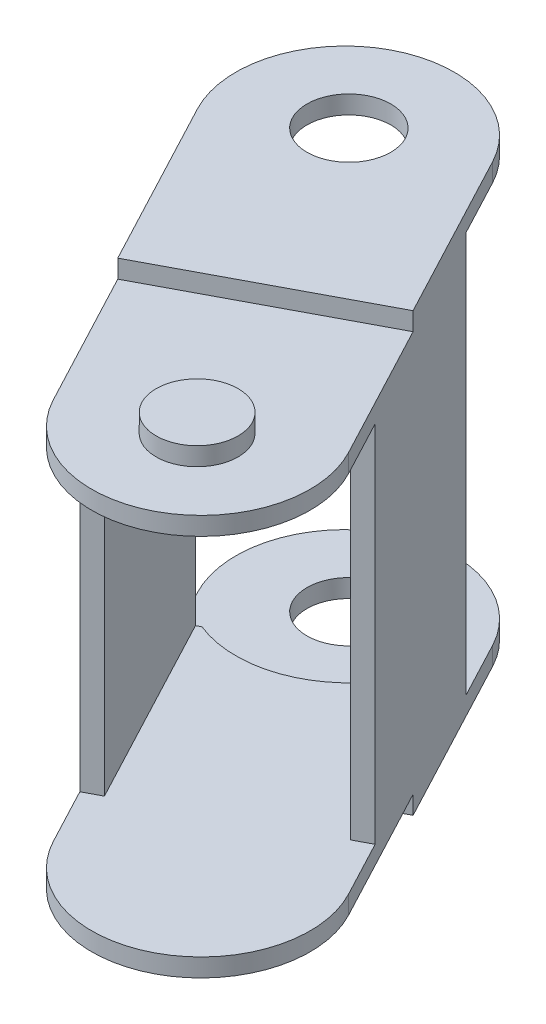
ISO-10303-21;
HEADER;
FILE_DESCRIPTION(('STEP AP214'),'2;1');
FILE_NAME('part.step','',(''),(''),'','','');
FILE_SCHEMA(('AUTOMOTIVE_DESIGN { 1 0 10303 214 1 1 1 1 }'));
ENDSEC;
DATA;
#1=APPLICATION_CONTEXT('core data for automotive mechanical design processes');
#2=APPLICATION_PROTOCOL_DEFINITION('international standard','automotive_design',2000,#1);
#3=PRODUCT_CONTEXT('',#1,'mechanical');
#4=PRODUCT('Part','Part','',(#3));
#5=PRODUCT_RELATED_PRODUCT_CATEGORY('part','',(#4));
#6=PRODUCT_DEFINITION_FORMATION('','',#4);
#7=PRODUCT_DEFINITION_CONTEXT('part definition',#1,'design');
#8=PRODUCT_DEFINITION('design','',#6,#7);
#9=PRODUCT_DEFINITION_SHAPE('','',#8);
#10=(LENGTH_UNIT() NAMED_UNIT(*) SI_UNIT(.MILLI.,.METRE.));
#11=(NAMED_UNIT(*) PLANE_ANGLE_UNIT() SI_UNIT($,.RADIAN.));
#12=(NAMED_UNIT(*) SI_UNIT($,.STERADIAN.) SOLID_ANGLE_UNIT());
#13=UNCERTAINTY_MEASURE_WITH_UNIT(LENGTH_MEASURE(1.E-05),#10,'distance_accuracy_value','');
#14=(GEOMETRIC_REPRESENTATION_CONTEXT(3) GLOBAL_UNCERTAINTY_ASSIGNED_CONTEXT((#13)) GLOBAL_UNIT_ASSIGNED_CONTEXT((#10,
#11,#12)) REPRESENTATION_CONTEXT('',''));
#15=CARTESIAN_POINT('',(0.,0.,0.));
#16=DIRECTION('',(0.,0.,1.));
#17=DIRECTION('',(1.,0.,0.));
#18=AXIS2_PLACEMENT_3D('',#15,#16,#17);
#19=CARTESIAN_POINT('',(-559.9840228653,21.5,64.14330006));
#20=DIRECTION('',(0.,1.,0.));
#21=DIRECTION('',(0.467407290881258,0.,0.884042094264206));
#22=AXIS2_PLACEMENT_3D('',#19,#20,#21);
#23=CYLINDRICAL_SURFACE('',#22,2.25);
#24=CARTESIAN_POINT('',(-559.9840228653,21.,64.14330006));
#25=DIRECTION('',(0.,1.,0.));
#26=DIRECTION('',(0.467407290881257,0.,0.884042094264207));
#27=AXIS2_PLACEMENT_3D('',#24,#25,#26);
#28=CIRCLE('',#27,2.25);
#29=CARTESIAN_POINT('',(-558.932356460817,21.,66.1323947720945));
#30=VERTEX_POINT('',#29);
#31=EDGE_CURVE('E205',#30,#30,#28,.F.);
#32=ORIENTED_EDGE('',*,*,#31,.F.);
#33=EDGE_LOOP('',(#32));
#34=FACE_BOUND('',#33,.T.);
#35=CARTESIAN_POINT('',(-559.9840228653,22.,64.14330006));
#36=DIRECTION('',(0.,-1.,0.));
#37=DIRECTION('',(-0.467407290881309,0.,-0.884042094264179));
#38=AXIS2_PLACEMENT_3D('',#35,#36,#37);
#39=CIRCLE('',#38,2.25);
#40=CARTESIAN_POINT('',(-561.035689269783,22.,62.1542053479056));
#41=VERTEX_POINT('',#40);
#42=EDGE_CURVE('E202',#41,#41,#39,.F.);
#43=ORIENTED_EDGE('',*,*,#42,.F.);
#44=EDGE_LOOP('',(#43));
#45=FACE_BOUND('',#44,.T.);
#46=ADVANCED_FACE('F17',(#34,#45),#23,.T.);
#47=CARTESIAN_POINT('',(-558.886435917672,21.,53.382477466249));
#48=DIRECTION('',(0.,1.,0.));
#49=DIRECTION('',(-0.884042094264264,0.,0.467407290881148));
#50=AXIS2_PLACEMENT_3D('',#47,#48,#49);
#51=PLANE('',#50);
#52=CARTESIAN_POINT('',(-560.217726510876,21.,63.701279012826));
#53=DIRECTION('',(0.,1.,0.));
#54=DIRECTION('',(0.467407290895964,0.,0.884042094256431));
#55=AXIS2_PLACEMENT_3D('',#52,#53,#54);
#56=CIRCLE('',#55,6.);
#57=CARTESIAN_POINT('',(-554.913473945278,21.,60.896835267562));
#58=VERTEX_POINT('',#57);
#59=CARTESIAN_POINT('',(-565.521979076352,21.,66.50572275806));
#60=VERTEX_POINT('',#59);
#61=EDGE_CURVE('E189',#58,#60,#56,.F.);
#62=ORIENTED_EDGE('',*,*,#61,.F.);
#63=DIRECTION('',(-0.467407290870953,0.,-0.884042094269654));
#64=VECTOR('',#63,1.);
#65=CARTESIAN_POINT('',(-554.913473945262,21.,60.896835267553));
#66=LINE('',#65,#64);
#67=CARTESIAN_POINT('',(-558.886435917672,21.,53.382477466249));
#68=VERTEX_POINT('',#67);
#69=EDGE_CURVE('E177',#68,#58,#66,.F.);
#70=ORIENTED_EDGE('',*,*,#69,.F.);
#71=DIRECTION('',(-0.884042094264259,0.,0.467407290881157));
#72=VECTOR('',#71,1.);
#73=CARTESIAN_POINT('',(-558.886435917672,21.,53.382477466249));
#74=LINE('',#73,#72);
#75=CARTESIAN_POINT('',(-569.4949410488,21.,58.9913649568));
#76=VERTEX_POINT('',#75);
#77=EDGE_CURVE('E188',#76,#68,#74,.F.);
#78=ORIENTED_EDGE('',*,*,#77,.F.);
#79=DIRECTION('',(0.467407290876608,0.,0.884042094266664));
#80=VECTOR('',#79,1.);
#81=CARTESIAN_POINT('',(-569.4949410488,21.,58.9913649568));
#82=LINE('',#81,#80);
#83=EDGE_CURVE('E201',#60,#76,#82,.F.);
#84=ORIENTED_EDGE('',*,*,#83,.F.);
#85=EDGE_LOOP('',(#62,#70,#78,#84));
#86=FACE_BOUND('',#85,.T.);
#87=ORIENTED_EDGE('',*,*,#31,.T.);
#88=EDGE_LOOP('',(#87));
#89=FACE_BOUND('',#88,.T.);
#90=ADVANCED_FACE('F199',(#86,#89),#51,.T.);
#91=CARTESIAN_POINT('',(-563.078003699836,22.,63.234009874265));
#92=DIRECTION('',(0.,1.,0.));
#93=DIRECTION('',(0.467407290881148,0.,0.884042094264264));
#94=AXIS2_PLACEMENT_3D('',#91,#92,#93);
#95=PLANE('',#94);
#96=ORIENTED_EDGE('',*,*,#42,.T.);
#97=EDGE_LOOP('',(#96));
#98=FACE_BOUND('',#97,.T.);
#99=ADVANCED_FACE('F629',(#98),#95,.T.);
#100=CARTESIAN_POINT('',(-560.217726510699,-2.,63.701279012733));
#101=DIRECTION('',(0.,1.,0.));
#102=DIRECTION('',(-0.884042094263944,0.,0.467407290881753));
#103=AXIS2_PLACEMENT_3D('',#100,#101,#102);
#104=CYLINDRICAL_SURFACE('',#103,6.);
#105=DIRECTION('',(9.891E-12,-1.,1.8645E-11));
#106=VECTOR('',#105,1.);
#107=CARTESIAN_POINT('',(-565.521979076283,21.,66.505722758023));
#108=LINE('',#107,#106);
#109=CARTESIAN_POINT('',(-565.521979076273,20.,66.505722758042));
#110=VERTEX_POINT('',#109);
#111=EDGE_CURVE('E217',#110,#60,#108,.F.);
#112=ORIENTED_EDGE('',*,*,#111,.F.);
#113=CARTESIAN_POINT('',(-560.217726510699,20.,63.701279012733));
#114=DIRECTION('',(0.,1.,0.));
#115=DIRECTION('',(-0.884042094262301,0.,0.467407290884861));
#116=AXIS2_PLACEMENT_3D('',#113,#114,#115);
#117=CIRCLE('',#116,6.);
#118=CARTESIAN_POINT('',(-554.913473945286,20.,60.896835267548));
#119=VERTEX_POINT('',#118);
#120=EDGE_CURVE('E196',#110,#119,#117,.T.);
#121=ORIENTED_EDGE('',*,*,#120,.T.);
#122=DIRECTION('',(7.503E-12,1.,1.4083E-11));
#123=VECTOR('',#122,1.);
#124=CARTESIAN_POINT('',(-554.913473945286,20.,60.896835267548));
#125=LINE('',#124,#123);
#126=EDGE_CURVE('E181',#119,#58,#125,.T.);
#127=ORIENTED_EDGE('',*,*,#126,.T.);
#128=ORIENTED_EDGE('',*,*,#61,.T.);
#129=EDGE_LOOP('',(#112,#121,#127,#128));
#130=FACE_BOUND('',#129,.T.);
#131=ADVANCED_FACE('F195',(#130),#104,.T.);
#132=CARTESIAN_POINT('',(-554.913473945188,-2.,60.896835267519));
#133=DIRECTION('',(0.884042094264264,0.,-0.467407290881148));
#134=DIRECTION('',(-0.467407290881148,0.,-0.884042094264264));
#135=AXIS2_PLACEMENT_3D('',#132,#133,#134);
#136=PLANE('',#135);
#137=DIRECTION('',(0.,-1.,0.));
#138=VECTOR('',#137,1.);
#139=CARTESIAN_POINT('',(-558.886435917686,22.,53.382477466257));
#140=LINE('',#139,#138);
#141=CARTESIAN_POINT('',(-558.886435917686,22.,53.382477466257));
#142=VERTEX_POINT('',#141);
#143=EDGE_CURVE('E184',#142,#68,#140,.T.);
#144=ORIENTED_EDGE('',*,*,#143,.T.);
#145=ORIENTED_EDGE('',*,*,#69,.T.);
#146=ORIENTED_EDGE('',*,*,#126,.F.);
#147=DIRECTION('',(-0.46740729088115,0.,-0.884042094264263));
#148=VECTOR('',#147,1.);
#149=CARTESIAN_POINT('',(-554.913473945198,20.,60.896835267501));
#150=LINE('',#149,#148);
#151=CARTESIAN_POINT('',(-556.549399463291,20.,57.802687937559));
#152=VERTEX_POINT('',#151);
#153=EDGE_CURVE('E229',#119,#152,#150,.T.);
#154=ORIENTED_EDGE('',*,*,#153,.T.);
#155=DIRECTION('',(0.,-1.,0.));
#156=VECTOR('',#155,1.);
#157=CARTESIAN_POINT('',(-556.549399463291,20.,57.802687937559));
#158=LINE('',#157,#156);
#159=CARTESIAN_POINT('',(-556.549399463291,0.,57.802687937559));
#160=VERTEX_POINT('',#159);
#161=EDGE_CURVE('E233',#152,#160,#158,.T.);
#162=ORIENTED_EDGE('',*,*,#161,.T.);
#163=DIRECTION('',(0.467407290881148,0.,0.884042094264264));
#164=VECTOR('',#163,1.);
#165=CARTESIAN_POINT('',(-556.549399463291,0.,57.802687937559));
#166=LINE('',#165,#164);
#167=CARTESIAN_POINT('',(-554.91347394519,0.,60.896835267515));
#168=VERTEX_POINT('',#167);
#169=EDGE_CURVE('E238',#160,#168,#166,.T.);
#170=ORIENTED_EDGE('',*,*,#169,.T.);
#171=DIRECTION('',(2.046E-12,-1.,3.894E-12));
#172=VECTOR('',#171,1.);
#173=CARTESIAN_POINT('',(-554.91347394519,0.,60.896835267515));
#174=LINE('',#173,#172);
#175=CARTESIAN_POINT('',(-554.913473945188,-1.,60.896835267519));
#176=VERTEX_POINT('',#175);
#177=EDGE_CURVE('E243',#176,#168,#174,.F.);
#178=ORIENTED_EDGE('',*,*,#177,.F.);
#179=DIRECTION('',(-0.467407290881144,0.,-0.884042094264266));
#180=VECTOR('',#179,1.);
#181=CARTESIAN_POINT('',(-554.913473945188,-1.,60.896835267519));
#182=LINE('',#181,#180);
#183=CARTESIAN_POINT('',(-558.886435917686,-1.,53.382477466257));
#184=VERTEX_POINT('',#183);
#185=EDGE_CURVE('E247',#176,#184,#182,.T.);
#186=ORIENTED_EDGE('',*,*,#185,.T.);
#187=DIRECTION('',(-1.14E-13,-1.,-1.49E-13));
#188=VECTOR('',#187,1.);
#189=CARTESIAN_POINT('',(-558.886435917686,-1.,53.382477466257));
#190=LINE('',#189,#188);
#191=CARTESIAN_POINT('',(-558.886435917686,-2.,53.382477466256));
#192=VERTEX_POINT('',#191);
#193=EDGE_CURVE('E252',#184,#192,#190,.T.);
#194=ORIENTED_EDGE('',*,*,#193,.T.);
#195=DIRECTION('',(-0.467407290881152,0.,-0.884042094264262));
#196=VECTOR('',#195,1.);
#197=CARTESIAN_POINT('',(-558.886435917686,-2.,53.382477466256));
#198=LINE('',#197,#196);
#199=CARTESIAN_POINT('',(-563.794212471897,-2.,44.10003547656));
#200=VERTEX_POINT('',#199);
#201=EDGE_CURVE('E257',#192,#200,#198,.T.);
#202=ORIENTED_EDGE('',*,*,#201,.T.);
#203=DIRECTION('',(1.14E-13,1.,0.));
#204=VECTOR('',#203,1.);
#205=CARTESIAN_POINT('',(-563.794212471897,-2.,44.10003547656));
#206=LINE('',#205,#204);
#207=CARTESIAN_POINT('',(-563.794212471897,-1.,44.10003547656));
#208=VERTEX_POINT('',#207);
#209=EDGE_CURVE('E262',#200,#208,#206,.T.);
#210=ORIENTED_EDGE('',*,*,#209,.T.);
#211=DIRECTION('',(0.467407290881133,0.,0.884042094264272));
#212=VECTOR('',#211,1.);
#213=CARTESIAN_POINT('',(-563.794212471897,-1.,44.10003547656));
#214=LINE('',#213,#212);
#215=CARTESIAN_POINT('',(-562.158286953875,-1.,47.194182806368));
#216=VERTEX_POINT('',#215);
#217=EDGE_CURVE('E267',#208,#216,#214,.T.);
#218=ORIENTED_EDGE('',*,*,#217,.T.);
#219=DIRECTION('',(0.,1.,0.));
#220=VECTOR('',#219,1.);
#221=CARTESIAN_POINT('',(-562.158286953875,-1.,47.194182806368));
#222=LINE('',#221,#220);
#223=CARTESIAN_POINT('',(-562.158286953875,21.,47.194182806368));
#224=VERTEX_POINT('',#223);
#225=EDGE_CURVE('E272',#216,#224,#222,.T.);
#226=ORIENTED_EDGE('',*,*,#225,.T.);
#227=DIRECTION('',(-0.467407290881148,0.,-0.884042094264264));
#228=VECTOR('',#227,1.);
#229=CARTESIAN_POINT('',(-562.158286953875,21.,47.194182806368));
#230=LINE('',#229,#228);
#231=CARTESIAN_POINT('',(-563.794212471897,21.,44.10003547656));
#232=VERTEX_POINT('',#231);
#233=EDGE_CURVE('E277',#224,#232,#230,.T.);
#234=ORIENTED_EDGE('',*,*,#233,.T.);
#235=DIRECTION('',(0.,1.,0.));
#236=VECTOR('',#235,1.);
#237=CARTESIAN_POINT('',(-563.794212471897,21.,44.10003547656));
#238=LINE('',#237,#236);
#239=CARTESIAN_POINT('',(-563.794212471897,22.,44.10003547656));
#240=VERTEX_POINT('',#239);
#241=EDGE_CURVE('E282',#232,#240,#238,.T.);
#242=ORIENTED_EDGE('',*,*,#241,.T.);
#243=DIRECTION('',(0.467407290881148,0.,0.884042094264264));
#244=VECTOR('',#243,1.);
#245=CARTESIAN_POINT('',(-563.794212471897,22.,44.10003547656));
#246=LINE('',#245,#244);
#247=EDGE_CURVE('E287',#240,#142,#246,.T.);
#248=ORIENTED_EDGE('',*,*,#247,.T.);
#249=EDGE_LOOP('',(#144,#145,#146,#154,#162,#170,#178,#186,#194,#202,#210,#218,#226,#234,#242,#248));
#250=FACE_BOUND('',#249,.T.);
#251=ADVANCED_FACE('F179',(#250),#136,.T.);
#252=CARTESIAN_POINT('',(-569.494941048811,21.,58.991364956806));
#253=DIRECTION('',(0.467407290881148,0.,0.884042094264264));
#254=DIRECTION('',(0.884042094264264,0.,-0.467407290881148));
#255=AXIS2_PLACEMENT_3D('',#252,#253,#254);
#256=PLANE('',#255);
#257=DIRECTION('',(-0.884042094264264,0.,0.467407290881148));
#258=VECTOR('',#257,1.);
#259=CARTESIAN_POINT('',(-558.886435917672,22.,53.382477466249));
#260=LINE('',#259,#258);
#261=CARTESIAN_POINT('',(-569.494941048811,22.,58.991364956806));
#262=VERTEX_POINT('',#261);
#263=EDGE_CURVE('E291',#262,#142,#260,.F.);
#264=ORIENTED_EDGE('',*,*,#263,.F.);
#265=DIRECTION('',(1.1141E-11,-1.,-5.883E-12));
#266=VECTOR('',#265,1.);
#267=CARTESIAN_POINT('',(-569.494941048811,22.,58.991364956806));
#268=LINE('',#267,#266);
#269=EDGE_CURVE('E295',#76,#262,#268,.F.);
#270=ORIENTED_EDGE('',*,*,#269,.F.);
#271=ORIENTED_EDGE('',*,*,#77,.T.);
#272=ORIENTED_EDGE('',*,*,#143,.F.);
#273=EDGE_LOOP('',(#264,#270,#271,#272));
#274=FACE_BOUND('',#273,.T.);
#275=ADVANCED_FACE('F613',(#274),#256,.T.);
#276=CARTESIAN_POINT('',(-574.402717603068,-2.,49.708922967134));
#277=DIRECTION('',(-0.884042094264264,0.,0.467407290881148));
#278=DIRECTION('',(0.467407290881148,0.,0.884042094264264));
#279=AXIS2_PLACEMENT_3D('',#276,#277,#278);
#280=PLANE('',#279);
#281=ORIENTED_EDGE('',*,*,#83,.T.);
#282=ORIENTED_EDGE('',*,*,#269,.T.);
#283=DIRECTION('',(-0.467407290881152,0.,-0.884042094264262));
#284=VECTOR('',#283,1.);
#285=CARTESIAN_POINT('',(-569.494941048857,22.,58.99136495683));
#286=LINE('',#285,#284);
#287=CARTESIAN_POINT('',(-574.402717603068,22.,49.708922967134));
#288=VERTEX_POINT('',#287);
#289=EDGE_CURVE('E300',#262,#288,#286,.T.);
#290=ORIENTED_EDGE('',*,*,#289,.T.);
#291=DIRECTION('',(0.,-1.,0.));
#292=VECTOR('',#291,1.);
#293=CARTESIAN_POINT('',(-574.402717603068,22.,49.708922967134));
#294=LINE('',#293,#292);
#295=CARTESIAN_POINT('',(-574.402717603068,21.,49.708922967134));
#296=VERTEX_POINT('',#295);
#297=EDGE_CURVE('E305',#296,#288,#294,.F.);
#298=ORIENTED_EDGE('',*,*,#297,.F.);
#299=DIRECTION('',(0.467407290881155,0.,0.88404209426426));
#300=VECTOR('',#299,1.);
#301=CARTESIAN_POINT('',(-574.402717603068,21.,49.708922967134));
#302=LINE('',#301,#300);
#303=CARTESIAN_POINT('',(-572.766792085046,21.,52.803070296942));
#304=VERTEX_POINT('',#303);
#305=EDGE_CURVE('E310',#296,#304,#302,.T.);
#306=ORIENTED_EDGE('',*,*,#305,.T.);
#307=DIRECTION('',(0.,-1.,0.));
#308=VECTOR('',#307,1.);
#309=CARTESIAN_POINT('',(-572.766792085046,21.,52.803070296942));
#310=LINE('',#309,#308);
#311=CARTESIAN_POINT('',(-572.766792085046,-1.,52.803070296942));
#312=VERTEX_POINT('',#311);
#313=EDGE_CURVE('E315',#304,#312,#310,.T.);
#314=ORIENTED_EDGE('',*,*,#313,.T.);
#315=DIRECTION('',(-0.467407290881164,0.,-0.884042094264256));
#316=VECTOR('',#315,1.);
#317=CARTESIAN_POINT('',(-572.766792085046,-1.,52.803070296942));
#318=LINE('',#317,#316);
#319=CARTESIAN_POINT('',(-574.402717603068,-1.,49.708922967134));
#320=VERTEX_POINT('',#319);
#321=EDGE_CURVE('E320',#312,#320,#318,.T.);
#322=ORIENTED_EDGE('',*,*,#321,.T.);
#323=DIRECTION('',(0.,-1.,0.));
#324=VECTOR('',#323,1.);
#325=CARTESIAN_POINT('',(-574.402717603068,-1.,49.708922967134));
#326=LINE('',#325,#324);
#327=CARTESIAN_POINT('',(-574.402717603068,-2.,49.708922967134));
#328=VERTEX_POINT('',#327);
#329=EDGE_CURVE('E325',#328,#320,#326,.F.);
#330=ORIENTED_EDGE('',*,*,#329,.F.);
#331=DIRECTION('',(0.467407290881145,0.,0.884042094264266));
#332=VECTOR('',#331,1.);
#333=CARTESIAN_POINT('',(-574.402717603068,-2.,49.708922967134));
#334=LINE('',#333,#332);
#335=CARTESIAN_POINT('',(-569.494941048857,-2.,58.99136495683));
#336=VERTEX_POINT('',#335);
#337=EDGE_CURVE('E330',#328,#336,#334,.T.);
#338=ORIENTED_EDGE('',*,*,#337,.T.);
#339=DIRECTION('',(1.14E-13,1.,0.));
#340=VECTOR('',#339,1.);
#341=CARTESIAN_POINT('',(-569.494941048857,-2.,58.99136495683));
#342=LINE('',#341,#340);
#343=CARTESIAN_POINT('',(-569.494941048857,-1.,58.99136495683));
#344=VERTEX_POINT('',#343);
#345=EDGE_CURVE('E335',#336,#344,#342,.T.);
#346=ORIENTED_EDGE('',*,*,#345,.T.);
#347=DIRECTION('',(0.467407290881141,0.,0.884042094264268));
#348=VECTOR('',#347,1.);
#349=CARTESIAN_POINT('',(-569.494941048857,-1.,58.99136495683));
#350=LINE('',#349,#348);
#351=CARTESIAN_POINT('',(-565.521979076371,-1.,66.50572275807));
#352=VERTEX_POINT('',#351);
#353=EDGE_CURVE('E340',#344,#352,#350,.T.);
#354=ORIENTED_EDGE('',*,*,#353,.T.);
#355=DIRECTION('',(2.501E-12,1.,4.69E-12));
#356=VECTOR('',#355,1.);
#357=CARTESIAN_POINT('',(-565.521979076371,-1.,66.50572275807));
#358=LINE('',#357,#356);
#359=CARTESIAN_POINT('',(-565.521979076369,0.,66.505722758075));
#360=VERTEX_POINT('',#359);
#361=EDGE_CURVE('E345',#352,#360,#358,.T.);
#362=ORIENTED_EDGE('',*,*,#361,.T.);
#363=DIRECTION('',(-0.467407290881145,0.,-0.884042094264266));
#364=VECTOR('',#363,1.);
#365=CARTESIAN_POINT('',(-565.521979076369,0.,66.505722758075));
#366=LINE('',#365,#364);
#367=CARTESIAN_POINT('',(-567.157904594462,0.,63.411575428133));
#368=VERTEX_POINT('',#367);
#369=EDGE_CURVE('E350',#360,#368,#366,.T.);
#370=ORIENTED_EDGE('',*,*,#369,.T.);
#371=DIRECTION('',(0.,1.,0.));
#372=VECTOR('',#371,1.);
#373=CARTESIAN_POINT('',(-567.157904594462,0.,63.411575428133));
#374=LINE('',#373,#372);
#375=CARTESIAN_POINT('',(-567.157904594462,20.,63.411575428133));
#376=VERTEX_POINT('',#375);
#377=EDGE_CURVE('E355',#368,#376,#374,.T.);
#378=ORIENTED_EDGE('',*,*,#377,.T.);
#379=DIRECTION('',(0.467407290881164,0.,0.884042094264256));
#380=VECTOR('',#379,1.);
#381=CARTESIAN_POINT('',(-567.157904594462,20.,63.411575428133));
#382=LINE('',#381,#380);
#383=EDGE_CURVE('E360',#376,#110,#382,.T.);
#384=ORIENTED_EDGE('',*,*,#383,.T.);
#385=ORIENTED_EDGE('',*,*,#111,.T.);
#386=EDGE_LOOP('',(#281,#282,#290,#298,#306,#314,#322,#330,#338,#346,#354,#362,#370,#378,#384,#385));
#387=FACE_BOUND('',#386,.T.);
#388=ADVANCED_FACE('F555',(#387),#280,.T.);
#389=CARTESIAN_POINT('',(-572.766792085031,20.,52.803070296933));
#390=DIRECTION('',(0.,-1.,0.));
#391=DIRECTION('',(0.884042094264264,0.,-0.467407290881148));
#392=AXIS2_PLACEMENT_3D('',#389,#390,#391);
#393=PLANE('',#392);
#394=CARTESIAN_POINT('',(-569.332168682923,20.,46.462458174715));
#395=DIRECTION('',(0.,1.,0.));
#396=DIRECTION('',(0.467407290881122,0.,0.884042094264278));
#397=AXIS2_PLACEMENT_3D('',#394,#395,#396);
#398=CIRCLE('',#397,6.2);
#399=CARTESIAN_POINT('',(-571.650324462012,20.,52.212775886274));
#400=VERTEX_POINT('',#399);
#401=CARTESIAN_POINT('',(-563.274754576909,20.,47.784477217036));
#402=VERTEX_POINT('',#401);
#403=EDGE_CURVE('E365',#400,#402,#398,.T.);
#404=ORIENTED_EDGE('',*,*,#403,.T.);
#405=DIRECTION('',(0.884042094264154,0.,-0.467407290881357));
#406=VECTOR('',#405,1.);
#407=CARTESIAN_POINT('',(-563.274754576909,20.,47.784477217036));
#408=LINE('',#407,#406);
#409=CARTESIAN_POINT('',(-563.042329048139,20.,47.661590097249));
#410=VERTEX_POINT('',#409);
#411=EDGE_CURVE('E370',#402,#410,#408,.T.);
#412=ORIENTED_EDGE('',*,*,#411,.T.);
#413=DIRECTION('',(0.467407290881126,0.,0.884042094264276));
#414=VECTOR('',#413,1.);
#415=CARTESIAN_POINT('',(-563.042329048139,20.,47.661590097249));
#416=LINE('',#415,#414);
#417=CARTESIAN_POINT('',(-557.433441557555,20.,58.27009522844));
#418=VERTEX_POINT('',#417);
#419=EDGE_CURVE('E375',#418,#410,#416,.F.);
#420=ORIENTED_EDGE('',*,*,#419,.F.);
#421=DIRECTION('',(0.884042094264369,0.,-0.46740729088095));
#422=VECTOR('',#421,1.);
#423=CARTESIAN_POINT('',(-557.433441557555,20.,58.27009522844));
#424=LINE('',#423,#422);
#425=EDGE_CURVE('E379',#152,#418,#424,.F.);
#426=ORIENTED_EDGE('',*,*,#425,.F.);
#427=ORIENTED_EDGE('',*,*,#153,.F.);
#428=ORIENTED_EDGE('',*,*,#120,.F.);
#429=ORIENTED_EDGE('',*,*,#383,.F.);
#430=DIRECTION('',(0.884042094264311,0.,-0.467407290881059));
#431=VECTOR('',#430,1.);
#432=CARTESIAN_POINT('',(-567.157904594446,20.,63.411575428124));
#433=LINE('',#432,#431);
#434=CARTESIAN_POINT('',(-566.273862500197,20.,62.944168137251));
#435=VERTEX_POINT('',#434);
#436=EDGE_CURVE('E384',#435,#376,#433,.F.);
#437=ORIENTED_EDGE('',*,*,#436,.F.);
#438=DIRECTION('',(-0.467407290881135,0.,-0.884042094264271));
#439=VECTOR('',#438,1.);
#440=CARTESIAN_POINT('',(-566.273862500197,20.,62.944168137251));
#441=LINE('',#440,#439);
#442=CARTESIAN_POINT('',(-571.882749990781,20.,52.335663006061));
#443=VERTEX_POINT('',#442);
#444=EDGE_CURVE('E388',#443,#435,#441,.F.);
#445=ORIENTED_EDGE('',*,*,#444,.F.);
#446=DIRECTION('',(0.884042094263498,0.,-0.467407290882598));
#447=VECTOR('',#446,1.);
#448=CARTESIAN_POINT('',(-571.882749990781,20.,52.335663006061));
#449=LINE('',#448,#447);
#450=EDGE_CURVE('E392',#443,#400,#449,.T.);
#451=ORIENTED_EDGE('',*,*,#450,.T.);
#452=EDGE_LOOP('',(#404,#412,#420,#426,#427,#428,#429,#437,#445,#451));
#453=FACE_BOUND('',#452,.T.);
#454=ADVANCED_FACE('F557',(#453),#393,.T.);
#455=CARTESIAN_POINT('',(-557.433441557555,20.,58.27009522844));
#456=DIRECTION('',(0.467407290881145,0.,0.884042094264266));
#457=DIRECTION('',(0.,-1.,0.));
#458=AXIS2_PLACEMENT_3D('',#455,#456,#457);
#459=PLANE('',#458);
#460=DIRECTION('',(0.,-1.,0.));
#461=VECTOR('',#460,1.);
#462=CARTESIAN_POINT('',(-557.433441557555,20.,58.27009522844));
#463=LINE('',#462,#461);
#464=CARTESIAN_POINT('',(-557.433441557555,0.,58.27009522844));
#465=VERTEX_POINT('',#464);
#466=EDGE_CURVE('E397',#465,#418,#463,.F.);
#467=ORIENTED_EDGE('',*,*,#466,.F.);
#468=DIRECTION('',(0.884042094264279,0.,-0.46740729088112));
#469=VECTOR('',#468,1.);
#470=CARTESIAN_POINT('',(-557.433441557555,0.,58.27009522844));
#471=LINE('',#470,#469);
#472=EDGE_CURVE('E401',#465,#160,#471,.T.);
#473=ORIENTED_EDGE('',*,*,#472,.T.);
#474=ORIENTED_EDGE('',*,*,#161,.F.);
#475=ORIENTED_EDGE('',*,*,#425,.T.);
#476=EDGE_LOOP('',(#467,#473,#474,#475));
#477=FACE_BOUND('',#476,.T.);
#478=ADVANCED_FACE('F563',(#477),#459,.T.);
#479=CARTESIAN_POINT('',(-572.766792085025,0.,52.803070296931));
#480=DIRECTION('',(0.,1.,0.));
#481=DIRECTION('',(0.467407290881148,0.,0.884042094264264));
#482=AXIS2_PLACEMENT_3D('',#479,#480,#481);
#483=PLANE('',#482);
#484=CARTESIAN_POINT('',(-569.332168682923,0.,46.462458174715));
#485=DIRECTION('',(0.,-1.,0.));
#486=DIRECTION('',(0.467407290881137,0.,0.88404209426427));
#487=AXIS2_PLACEMENT_3D('',#484,#485,#486);
#488=CIRCLE('',#487,6.2);
#489=CARTESIAN_POINT('',(-563.274754576909,0.,47.784477217036));
#490=VERTEX_POINT('',#489);
#491=CARTESIAN_POINT('',(-571.650324462012,0.,52.212775886274));
#492=VERTEX_POINT('',#491);
#493=EDGE_CURVE('E406',#490,#492,#488,.T.);
#494=ORIENTED_EDGE('',*,*,#493,.T.);
#495=DIRECTION('',(-0.884042094263938,0.,0.467407290881764));
#496=VECTOR('',#495,1.);
#497=CARTESIAN_POINT('',(-571.650324462012,0.,52.212775886274));
#498=LINE('',#497,#496);
#499=CARTESIAN_POINT('',(-571.882749990781,0.,52.335663006061));
#500=VERTEX_POINT('',#499);
#501=EDGE_CURVE('E411',#492,#500,#498,.T.);
#502=ORIENTED_EDGE('',*,*,#501,.T.);
#503=DIRECTION('',(0.467407290881137,0.,0.88404209426427));
#504=VECTOR('',#503,1.);
#505=CARTESIAN_POINT('',(-571.882749990781,0.,52.335663006061));
#506=LINE('',#505,#504);
#507=CARTESIAN_POINT('',(-566.273862500197,0.,62.944168137251));
#508=VERTEX_POINT('',#507);
#509=EDGE_CURVE('E416',#508,#500,#506,.F.);
#510=ORIENTED_EDGE('',*,*,#509,.F.);
#511=DIRECTION('',(-0.884042094264277,0.,0.467407290881123));
#512=VECTOR('',#511,1.);
#513=CARTESIAN_POINT('',(-566.273862500197,0.,62.944168137251));
#514=LINE('',#513,#512);
#515=EDGE_CURVE('E420',#368,#508,#514,.F.);
#516=ORIENTED_EDGE('',*,*,#515,.F.);
#517=ORIENTED_EDGE('',*,*,#369,.F.);
#518=CARTESIAN_POINT('',(-560.217726510876,0.,63.701279012826));
#519=DIRECTION('',(0.,1.,0.));
#520=DIRECTION('',(0.467407290895982,0.,0.884042094256421));
#521=AXIS2_PLACEMENT_3D('',#518,#519,#520);
#522=CIRCLE('',#521,6.);
#523=EDGE_CURVE('E425',#168,#360,#522,.F.);
#524=ORIENTED_EDGE('',*,*,#523,.F.);
#525=ORIENTED_EDGE('',*,*,#169,.F.);
#526=ORIENTED_EDGE('',*,*,#472,.F.);
#527=DIRECTION('',(-0.467407290881135,0.,-0.884042094264271));
#528=VECTOR('',#527,1.);
#529=CARTESIAN_POINT('',(-557.433441557555,0.,58.27009522844));
#530=LINE('',#529,#528);
#531=CARTESIAN_POINT('',(-563.042329048139,0.,47.661590097249));
#532=VERTEX_POINT('',#531);
#533=EDGE_CURVE('E429',#532,#465,#530,.F.);
#534=ORIENTED_EDGE('',*,*,#533,.F.);
#535=DIRECTION('',(-0.884042094263954,0.,0.467407290881735));
#536=VECTOR('',#535,1.);
#537=CARTESIAN_POINT('',(-563.042329048139,0.,47.661590097249));
#538=LINE('',#537,#536);
#539=EDGE_CURVE('E433',#532,#490,#538,.T.);
#540=ORIENTED_EDGE('',*,*,#539,.T.);
#541=EDGE_LOOP('',(#494,#502,#510,#516,#517,#524,#525,#526,#534,#540));
#542=FACE_BOUND('',#541,.T.);
#543=ADVANCED_FACE('F549',(#542),#483,.T.);
#544=CARTESIAN_POINT('',(-560.217726510876,-2.,63.701279012826));
#545=DIRECTION('',(0.,1.,0.));
#546=DIRECTION('',(0.467407290895968,0.,0.884042094256429));
#547=AXIS2_PLACEMENT_3D('',#544,#545,#546);
#548=CYLINDRICAL_SURFACE('',#547,6.);
#549=ORIENTED_EDGE('',*,*,#177,.T.);
#550=ORIENTED_EDGE('',*,*,#523,.T.);
#551=ORIENTED_EDGE('',*,*,#361,.F.);
#552=CARTESIAN_POINT('',(-560.217726510699,-1.,63.701279012733));
#553=DIRECTION('',(0.,-1.,0.));
#554=DIRECTION('',(0.467407290866486,0.,0.884042094272016));
#555=AXIS2_PLACEMENT_3D('',#552,#553,#554);
#556=CIRCLE('',#555,6.);
#557=EDGE_CURVE('E438',#352,#176,#556,.F.);
#558=ORIENTED_EDGE('',*,*,#557,.T.);
#559=EDGE_LOOP('',(#549,#550,#551,#558));
#560=FACE_BOUND('',#559,.T.);
#561=ADVANCED_FACE('F570',(#560),#548,.T.);
#562=CARTESIAN_POINT('',(-569.494941048843,-1.,58.991364956823));
#563=DIRECTION('',(0.,-1.,0.));
#564=DIRECTION('',(0.884042094264264,0.,-0.467407290881148));
#565=AXIS2_PLACEMENT_3D('',#562,#563,#564);
#566=PLANE('',#565);
#567=ORIENTED_EDGE('',*,*,#557,.F.);
#568=ORIENTED_EDGE('',*,*,#353,.F.);
#569=DIRECTION('',(0.88404209426426,0.,-0.467407290881155));
#570=VECTOR('',#569,1.);
#571=CARTESIAN_POINT('',(-569.494941048843,-1.,58.991364956823));
#572=LINE('',#571,#570);
#573=EDGE_CURVE('E443',#344,#184,#572,.T.);
#574=ORIENTED_EDGE('',*,*,#573,.T.);
#575=ORIENTED_EDGE('',*,*,#185,.F.);
#576=EDGE_LOOP('',(#567,#568,#574,#575));
#577=FACE_BOUND('',#576,.T.);
#578=CARTESIAN_POINT('',(-559.9840228653,-1.,64.14330006));
#579=DIRECTION('',(0.,1.,0.));
#580=DIRECTION('',(0.467407290881296,0.,0.884042094264186));
#581=AXIS2_PLACEMENT_3D('',#578,#579,#580);
#582=CIRCLE('',#581,2.25);
#583=CARTESIAN_POINT('',(-558.932356460817,-1.,66.1323947720944));
#584=VERTEX_POINT('',#583);
#585=EDGE_CURVE('E448',#584,#584,#582,.T.);
#586=ORIENTED_EDGE('',*,*,#585,.T.);
#587=EDGE_LOOP('',(#586));
#588=FACE_BOUND('',#587,.T.);
#589=ADVANCED_FACE('F574',(#577,#588),#566,.T.);
#590=CARTESIAN_POINT('',(-569.494941048843,-2.,58.991364956823));
#591=DIRECTION('',(0.467407290881148,0.,0.884042094264264));
#592=DIRECTION('',(0.884042094264264,0.,-0.467407290881148));
#593=AXIS2_PLACEMENT_3D('',#590,#591,#592);
#594=PLANE('',#593);
#595=ORIENTED_EDGE('',*,*,#573,.F.);
#596=ORIENTED_EDGE('',*,*,#345,.F.);
#597=DIRECTION('',(0.884042094264265,0.,-0.467407290881147));
#598=VECTOR('',#597,1.);
#599=CARTESIAN_POINT('',(-569.494941048834,-2.,58.991364956818));
#600=LINE('',#599,#598);
#601=EDGE_CURVE('E453',#192,#336,#600,.F.);
#602=ORIENTED_EDGE('',*,*,#601,.F.);
#603=ORIENTED_EDGE('',*,*,#193,.F.);
#604=EDGE_LOOP('',(#595,#596,#602,#603));
#605=FACE_BOUND('',#604,.T.);
#606=ADVANCED_FACE('F578',(#605),#594,.T.);
#607=CARTESIAN_POINT('',(-577.207161348285,-2.,44.404670401624));
#608=DIRECTION('',(0.,-1.,0.));
#609=DIRECTION('',(0.884042094264264,0.,-0.467407290881148));
#610=AXIS2_PLACEMENT_3D('',#607,#608,#609);
#611=PLANE('',#610);
#612=ORIENTED_EDGE('',*,*,#601,.T.);
#613=ORIENTED_EDGE('',*,*,#337,.F.);
#614=CARTESIAN_POINT('',(-569.098465037524,-2.,46.904479221982));
#615=DIRECTION('',(0.,-1.,0.));
#616=DIRECTION('',(-0.467407290866339,0.,-0.884042094272094));
#617=AXIS2_PLACEMENT_3D('',#614,#615,#616);
#618=CIRCLE('',#617,6.);
#619=EDGE_CURVE('E455',#200,#328,#618,.F.);
#620=ORIENTED_EDGE('',*,*,#619,.F.);
#621=ORIENTED_EDGE('',*,*,#201,.F.);
#622=EDGE_LOOP('',(#612,#613,#620,#621));
#623=FACE_BOUND('',#622,.T.);
#624=CARTESIAN_POINT('',(-569.3321686827,-2.,46.4624581746));
#625=DIRECTION('',(0.,1.,0.));
#626=DIRECTION('',(0.467407290881318,0.,0.884042094264174));
#627=AXIS2_PLACEMENT_3D('',#624,#625,#626);
#628=CIRCLE('',#627,2.3);
#629=CARTESIAN_POINT('',(-568.257131913673,-2.,48.4957549914076));
#630=VERTEX_POINT('',#629);
#631=EDGE_CURVE('E459',#630,#630,#628,.T.);
#632=ORIENTED_EDGE('',*,*,#631,.T.);
#633=EDGE_LOOP('',(#632));
#634=FACE_BOUND('',#633,.T.);
#635=ADVANCED_FACE('F581',(#623,#634),#611,.T.);
#636=CARTESIAN_POINT('',(-569.098465037524,-2.,46.904479221982));
#637=DIRECTION('',(0.,1.,0.));
#638=DIRECTION('',(0.884042094256467,0.,-0.467407290895896));
#639=AXIS2_PLACEMENT_3D('',#636,#637,#638);
#640=CYLINDRICAL_SURFACE('',#639,6.);
#641=ORIENTED_EDGE('',*,*,#209,.F.);
#642=ORIENTED_EDGE('',*,*,#619,.T.);
#643=ORIENTED_EDGE('',*,*,#329,.T.);
#644=CARTESIAN_POINT('',(-569.098465037347,-1.,46.904479221889));
#645=DIRECTION('',(0.,1.,0.));
#646=DIRECTION('',(-0.467407290895849,0.,-0.884042094256491));
#647=AXIS2_PLACEMENT_3D('',#644,#645,#646);
#648=CIRCLE('',#647,6.);
#649=EDGE_CURVE('E464',#320,#208,#648,.F.);
#650=ORIENTED_EDGE('',*,*,#649,.T.);
#651=EDGE_LOOP('',(#641,#642,#643,#650));
#652=FACE_BOUND('',#651,.T.);
#653=ADVANCED_FACE('F587',(#652),#640,.T.);
#654=CARTESIAN_POINT('',(-577.20716134822,-1.,44.40467040159));
#655=DIRECTION('',(0.,1.,0.));
#656=DIRECTION('',(0.467407290881148,0.,0.884042094264264));
#657=AXIS2_PLACEMENT_3D('',#654,#655,#656);
#658=PLANE('',#657);
#659=ORIENTED_EDGE('',*,*,#217,.F.);
#660=ORIENTED_EDGE('',*,*,#649,.F.);
#661=ORIENTED_EDGE('',*,*,#321,.F.);
#662=DIRECTION('',(0.884042094264084,0.,-0.467407290881489));
#663=VECTOR('',#662,1.);
#664=CARTESIAN_POINT('',(-572.76679208488,-1.,52.803070296855));
#665=LINE('',#664,#663);
#666=CARTESIAN_POINT('',(-571.650324462012,-1.,52.212775886274));
#667=VERTEX_POINT('',#666);
#668=EDGE_CURVE('E467',#667,#312,#665,.F.);
#669=ORIENTED_EDGE('',*,*,#668,.F.);
#670=CARTESIAN_POINT('',(-569.332168682923,-1.,46.462458174715));
#671=DIRECTION('',(0.,1.,0.));
#672=DIRECTION('',(0.467407290881107,0.,0.884042094264286));
#673=AXIS2_PLACEMENT_3D('',#670,#671,#672);
#674=CIRCLE('',#673,6.2);
#675=CARTESIAN_POINT('',(-563.274754576909,-1.,47.784477217036));
#676=VERTEX_POINT('',#675);
#677=EDGE_CURVE('E471',#676,#667,#674,.F.);
#678=ORIENTED_EDGE('',*,*,#677,.F.);
#679=DIRECTION('',(0.884042094264222,0.,-0.467407290881228));
#680=VECTOR('',#679,1.);
#681=CARTESIAN_POINT('',(-563.274754576909,-1.,47.784477217036));
#682=LINE('',#681,#680);
#683=EDGE_CURVE('E475',#216,#676,#682,.F.);
#684=ORIENTED_EDGE('',*,*,#683,.F.);
#685=EDGE_LOOP('',(#659,#660,#661,#669,#678,#684));
#686=FACE_BOUND('',#685,.T.);
#687=CARTESIAN_POINT('',(-569.3321686827,-1.,46.4624581746));
#688=DIRECTION('',(0.,-1.,0.));
#689=DIRECTION('',(-0.467407290881286,0.,-0.884042094264191));
#690=AXIS2_PLACEMENT_3D('',#687,#688,#689);
#691=CIRCLE('',#690,2.3);
#692=CARTESIAN_POINT('',(-570.407205451727,-1.,44.4291613577924));
#693=VERTEX_POINT('',#692);
#694=EDGE_CURVE('E480',#693,#693,#691,.T.);
#695=ORIENTED_EDGE('',*,*,#694,.T.);
#696=EDGE_LOOP('',(#695));
#697=FACE_BOUND('',#696,.T.);
#698=ADVANCED_FACE('F590',(#686,#697),#658,.T.);
#699=CARTESIAN_POINT('',(-563.274754576909,-1.,47.784477217036));
#700=DIRECTION('',(-0.467407290881148,0.,-0.884042094264264));
#701=DIRECTION('',(0.,1.,0.));
#702=AXIS2_PLACEMENT_3D('',#699,#700,#701);
#703=PLANE('',#702);
#704=DIRECTION('',(-1.14E-13,1.,0.));
#705=VECTOR('',#704,1.);
#706=CARTESIAN_POINT('',(-563.274754576909,20.,47.784477217035));
#707=LINE('',#706,#705);
#708=CARTESIAN_POINT('',(-563.274754576909,21.,47.784477217036));
#709=VERTEX_POINT('',#708);
#710=EDGE_CURVE('E485',#402,#709,#707,.T.);
#711=ORIENTED_EDGE('',*,*,#710,.T.);
#712=DIRECTION('',(0.884042094264262,0.,-0.467407290881151));
#713=VECTOR('',#712,1.);
#714=CARTESIAN_POINT('',(-563.274754576909,21.,47.784477217036));
#715=LINE('',#714,#713);
#716=EDGE_CURVE('E487',#709,#224,#715,.T.);
#717=ORIENTED_EDGE('',*,*,#716,.T.);
#718=ORIENTED_EDGE('',*,*,#225,.F.);
#719=ORIENTED_EDGE('',*,*,#683,.T.);
#720=DIRECTION('',(-1.14E-13,1.,0.));
#721=VECTOR('',#720,1.);
#722=CARTESIAN_POINT('',(-563.274754576909,-1.,47.784477217035));
#723=LINE('',#722,#721);
#724=EDGE_CURVE('E492',#676,#490,#723,.T.);
#725=ORIENTED_EDGE('',*,*,#724,.T.);
#726=ORIENTED_EDGE('',*,*,#539,.F.);
#727=DIRECTION('',(0.,1.,0.));
#728=VECTOR('',#727,1.);
#729=CARTESIAN_POINT('',(-563.042329048139,0.,47.661590097249));
#730=LINE('',#729,#728);
#731=EDGE_CURVE('E497',#410,#532,#730,.F.);
#732=ORIENTED_EDGE('',*,*,#731,.F.);
#733=ORIENTED_EDGE('',*,*,#411,.F.);
#734=EDGE_LOOP('',(#711,#717,#718,#719,#725,#726,#732,#733));
#735=FACE_BOUND('',#734,.T.);
#736=ADVANCED_FACE('F595',(#735),#703,.T.);
#737=CARTESIAN_POINT('',(-577.207161348247,21.,44.404670401604));
#738=DIRECTION('',(0.,-1.,0.));
#739=DIRECTION('',(0.884042094264264,0.,-0.467407290881148));
#740=AXIS2_PLACEMENT_3D('',#737,#738,#739);
#741=PLANE('',#740);
#742=ORIENTED_EDGE('',*,*,#305,.F.);
#743=CARTESIAN_POINT('',(-569.098465037524,21.,46.904479221982));
#744=DIRECTION('',(0.,-1.,0.));
#745=DIRECTION('',(-0.467407290866358,0.,-0.884042094272084));
#746=AXIS2_PLACEMENT_3D('',#743,#744,#745);
#747=CIRCLE('',#746,6.);
#748=EDGE_CURVE('E501',#232,#296,#747,.F.);
#749=ORIENTED_EDGE('',*,*,#748,.F.);
#750=ORIENTED_EDGE('',*,*,#233,.F.);
#751=ORIENTED_EDGE('',*,*,#716,.F.);
#752=CARTESIAN_POINT('',(-569.332168682923,21.,46.462458174715));
#753=DIRECTION('',(0.,-1.,0.));
#754=DIRECTION('',(0.467407290881137,0.,0.88404209426427));
#755=AXIS2_PLACEMENT_3D('',#752,#753,#754);
#756=CIRCLE('',#755,6.2);
#757=CARTESIAN_POINT('',(-571.650324462012,21.,52.212775886274));
#758=VERTEX_POINT('',#757);
#759=EDGE_CURVE('E36',#758,#709,#756,.F.);
#760=ORIENTED_EDGE('',*,*,#759,.F.);
#761=DIRECTION('',(-0.884042094264216,0.,0.467407290881239));
#762=VECTOR('',#761,1.);
#763=CARTESIAN_POINT('',(-571.650324462012,21.,52.212775886274));
#764=LINE('',#763,#762);
#765=EDGE_CURVE('E508',#304,#758,#764,.F.);
#766=ORIENTED_EDGE('',*,*,#765,.F.);
#767=EDGE_LOOP('',(#742,#749,#750,#751,#760,#766));
#768=FACE_BOUND('',#767,.T.);
#769=CARTESIAN_POINT('',(-569.3321686827,21.,46.4624581746));
#770=DIRECTION('',(0.,1.,0.));
#771=DIRECTION('',(-0.467407290881282,0.,-0.884042094264193));
#772=AXIS2_PLACEMENT_3D('',#769,#770,#771);
#773=CIRCLE('',#772,2.3);
#774=CARTESIAN_POINT('',(-570.407205451727,21.,44.4291613577924));
#775=VERTEX_POINT('',#774);
#776=EDGE_CURVE('E513',#775,#775,#773,.T.);
#777=ORIENTED_EDGE('',*,*,#776,.T.);
#778=EDGE_LOOP('',(#777));
#779=FACE_BOUND('',#778,.T.);
#780=ADVANCED_FACE('F600',(#768,#779),#741,.T.);
#781=CARTESIAN_POINT('',(-569.098465037524,-2.,46.904479221982));
#782=DIRECTION('',(0.,1.,0.));
#783=DIRECTION('',(0.884042094256465,0.,-0.467407290895898));
#784=AXIS2_PLACEMENT_3D('',#781,#782,#783);
#785=CYLINDRICAL_SURFACE('',#784,6.);
#786=ORIENTED_EDGE('',*,*,#748,.T.);
#787=ORIENTED_EDGE('',*,*,#297,.T.);
#788=CARTESIAN_POINT('',(-569.098465037347,22.,46.904479221889));
#789=DIRECTION('',(0.,1.,0.));
#790=DIRECTION('',(-0.467407290895849,0.,-0.884042094256491));
#791=AXIS2_PLACEMENT_3D('',#788,#789,#790);
#792=CIRCLE('',#791,6.);
#793=EDGE_CURVE('E518',#288,#240,#792,.F.);
#794=ORIENTED_EDGE('',*,*,#793,.T.);
#795=ORIENTED_EDGE('',*,*,#241,.F.);
#796=EDGE_LOOP('',(#786,#787,#794,#795));
#797=FACE_BOUND('',#796,.T.);
#798=ADVANCED_FACE('F605',(#797),#785,.T.);
#799=CARTESIAN_POINT('',(-577.207161348297,22.,44.40467040163));
#800=DIRECTION('',(0.,1.,0.));
#801=DIRECTION('',(0.467407290881148,0.,0.884042094264264));
#802=AXIS2_PLACEMENT_3D('',#799,#800,#801);
#803=PLANE('',#802);
#804=ORIENTED_EDGE('',*,*,#263,.T.);
#805=ORIENTED_EDGE('',*,*,#247,.F.);
#806=ORIENTED_EDGE('',*,*,#793,.F.);
#807=ORIENTED_EDGE('',*,*,#289,.F.);
#808=EDGE_LOOP('',(#804,#805,#806,#807));
#809=FACE_BOUND('',#808,.T.);
#810=CARTESIAN_POINT('',(-569.3321686827,22.,46.4624581746));
#811=DIRECTION('',(0.,-1.,0.));
#812=DIRECTION('',(0.467407290881233,0.,0.884042094264219));
#813=AXIS2_PLACEMENT_3D('',#810,#811,#812);
#814=CIRCLE('',#813,2.3);
#815=CARTESIAN_POINT('',(-568.257131913673,22.,48.4957549914077));
#816=VERTEX_POINT('',#815);
#817=EDGE_CURVE('E521',#816,#816,#814,.T.);
#818=ORIENTED_EDGE('',*,*,#817,.T.);
#819=EDGE_LOOP('',(#818));
#820=FACE_BOUND('',#819,.T.);
#821=ADVANCED_FACE('F608',(#809,#820),#803,.T.);
#822=CARTESIAN_POINT('',(-572.76679208488,-1.,52.803070296854));
#823=DIRECTION('',(-0.467407290881148,0.,-0.884042094264264));
#824=DIRECTION('',(0.,1.,0.));
#825=AXIS2_PLACEMENT_3D('',#822,#823,#824);
#826=PLANE('',#825);
#827=DIRECTION('',(0.,-1.,0.));
#828=VECTOR('',#827,1.);
#829=CARTESIAN_POINT('',(-571.650324462012,21.,52.212775886275));
#830=LINE('',#829,#828);
#831=EDGE_CURVE('E32',#758,#400,#830,.T.);
#832=ORIENTED_EDGE('',*,*,#831,.T.);
#833=ORIENTED_EDGE('',*,*,#450,.F.);
#834=DIRECTION('',(0.,-1.,0.));
#835=VECTOR('',#834,1.);
#836=CARTESIAN_POINT('',(-571.882749990781,20.,52.335663006061));
#837=LINE('',#836,#835);
#838=EDGE_CURVE('E527',#500,#443,#837,.F.);
#839=ORIENTED_EDGE('',*,*,#838,.F.);
#840=ORIENTED_EDGE('',*,*,#501,.F.);
#841=DIRECTION('',(0.,-1.,0.));
#842=VECTOR('',#841,1.);
#843=CARTESIAN_POINT('',(-571.650324462012,0.,52.212775886275));
#844=LINE('',#843,#842);
#845=EDGE_CURVE('E531',#492,#667,#844,.T.);
#846=ORIENTED_EDGE('',*,*,#845,.T.);
#847=ORIENTED_EDGE('',*,*,#668,.T.);
#848=ORIENTED_EDGE('',*,*,#313,.F.);
#849=ORIENTED_EDGE('',*,*,#765,.T.);
#850=EDGE_LOOP('',(#832,#833,#839,#840,#846,#847,#848,#849));
#851=FACE_BOUND('',#850,.T.);
#852=ADVANCED_FACE('F781',(#851),#826,.T.);
#853=CARTESIAN_POINT('',(-567.157904594446,20.,63.411575428125));
#854=DIRECTION('',(0.467407290881145,0.,0.884042094264266));
#855=DIRECTION('',(0.,-1.,0.));
#856=AXIS2_PLACEMENT_3D('',#853,#854,#855);
#857=PLANE('',#856);
#858=DIRECTION('',(0.,1.,0.));
#859=VECTOR('',#858,1.);
#860=CARTESIAN_POINT('',(-566.273862500197,0.,62.944168137251));
#861=LINE('',#860,#859);
#862=EDGE_CURVE('E25',#435,#508,#861,.F.);
#863=ORIENTED_EDGE('',*,*,#862,.F.);
#864=ORIENTED_EDGE('',*,*,#436,.T.);
#865=ORIENTED_EDGE('',*,*,#377,.F.);
#866=ORIENTED_EDGE('',*,*,#515,.T.);
#867=EDGE_LOOP('',(#863,#864,#865,#866));
#868=FACE_BOUND('',#867,.T.);
#869=ADVANCED_FACE('F552',(#868),#857,.T.);
#870=CARTESIAN_POINT('',(-569.332168682923,20.5,46.462458174715));
#871=DIRECTION('',(0.,1.,0.));
#872=DIRECTION('',(-0.373896093401452,0.,0.927470598638649));
#873=AXIS2_PLACEMENT_3D('',#870,#871,#872);
#874=CYLINDRICAL_SURFACE('',#873,6.2);
#875=ORIENTED_EDGE('',*,*,#831,.F.);
#876=ORIENTED_EDGE('',*,*,#759,.T.);
#877=ORIENTED_EDGE('',*,*,#710,.F.);
#878=ORIENTED_EDGE('',*,*,#403,.F.);
#879=EDGE_LOOP('',(#875,#876,#877,#878));
#880=FACE_BOUND('',#879,.T.);
#881=ADVANCED_FACE('F801',(#880),#874,.F.);
#882=CARTESIAN_POINT('',(-563.042329048139,20.,47.661590097249));
#883=DIRECTION('',(-0.884042094264264,0.,0.467407290881148));
#884=DIRECTION('',(0.,-1.,0.));
#885=AXIS2_PLACEMENT_3D('',#882,#883,#884);
#886=PLANE('',#885);
#887=ORIENTED_EDGE('',*,*,#731,.T.);
#888=ORIENTED_EDGE('',*,*,#533,.T.);
#889=ORIENTED_EDGE('',*,*,#466,.T.);
#890=ORIENTED_EDGE('',*,*,#419,.T.);
#891=EDGE_LOOP('',(#887,#888,#889,#890));
#892=FACE_BOUND('',#891,.T.);
#893=ADVANCED_FACE('F811',(#892),#886,.T.);
#894=CARTESIAN_POINT('',(-571.882749990781,0.,52.335663006061));
#895=DIRECTION('',(0.884042094264264,0.,-0.467407290881148));
#896=DIRECTION('',(0.,1.,0.));
#897=AXIS2_PLACEMENT_3D('',#894,#895,#896);
#898=PLANE('',#897);
#899=ORIENTED_EDGE('',*,*,#838,.T.);
#900=ORIENTED_EDGE('',*,*,#444,.T.);
#901=ORIENTED_EDGE('',*,*,#862,.T.);
#902=ORIENTED_EDGE('',*,*,#509,.T.);
#903=EDGE_LOOP('',(#899,#900,#901,#902));
#904=FACE_BOUND('',#903,.T.);
#905=ADVANCED_FACE('F542',(#904),#898,.T.);
#906=CARTESIAN_POINT('',(-569.332168682923,-0.5,46.462458174715));
#907=DIRECTION('',(0.,1.,0.));
#908=DIRECTION('',(0.467407290881123,0.,0.884042094264278));
#909=AXIS2_PLACEMENT_3D('',#906,#907,#908);
#910=CYLINDRICAL_SURFACE('',#909,6.2);
#911=ORIENTED_EDGE('',*,*,#724,.F.);
#912=ORIENTED_EDGE('',*,*,#677,.T.);
#913=ORIENTED_EDGE('',*,*,#845,.F.);
#914=ORIENTED_EDGE('',*,*,#493,.F.);
#915=EDGE_LOOP('',(#911,#912,#913,#914));
#916=FACE_BOUND('',#915,.T.);
#917=ADVANCED_FACE('F831',(#916),#910,.F.);
#918=CARTESIAN_POINT('',(-559.9840228653,-1.5,64.14330006));
#919=DIRECTION('',(0.,1.,0.));
#920=DIRECTION('',(0.467407290881258,0.,0.884042094264206));
#921=AXIS2_PLACEMENT_3D('',#918,#919,#920);
#922=CYLINDRICAL_SURFACE('',#921,2.25);
#923=CARTESIAN_POINT('',(-559.9840228653,-2.,64.14330006));
#924=DIRECTION('',(0.,1.,0.));
#925=DIRECTION('',(0.467407290881257,0.,0.884042094264207));
#926=AXIS2_PLACEMENT_3D('',#923,#924,#925);
#927=CIRCLE('',#926,2.25);
#928=CARTESIAN_POINT('',(-558.932356460817,-2.,66.1323947720945));
#929=VERTEX_POINT('',#928);
#930=EDGE_CURVE('E11',#929,#929,#927,.F.);
#931=ORIENTED_EDGE('',*,*,#930,.F.);
#932=EDGE_LOOP('',(#931));
#933=FACE_BOUND('',#932,.T.);
#934=ORIENTED_EDGE('',*,*,#585,.F.);
#935=EDGE_LOOP('',(#934));
#936=FACE_BOUND('',#935,.T.);
#937=ADVANCED_FACE('F841',(#933,#936),#922,.T.);
#938=CARTESIAN_POINT('',(-569.3321686827,10.,46.4624581746));
#939=DIRECTION('',(0.,1.,0.));
#940=DIRECTION('',(0.467407290881237,0.,0.884042094264217));
#941=AXIS2_PLACEMENT_3D('',#938,#939,#940);
#942=CYLINDRICAL_SURFACE('',#941,2.3);
#943=ORIENTED_EDGE('',*,*,#694,.F.);
#944=EDGE_LOOP('',(#943));
#945=FACE_BOUND('',#944,.T.);
#946=ORIENTED_EDGE('',*,*,#631,.F.);
#947=EDGE_LOOP('',(#946));
#948=FACE_BOUND('',#947,.T.);
#949=ADVANCED_FACE('F852',(#945,#948),#942,.F.);
#950=CARTESIAN_POINT('',(-569.3321686827,10.,46.4624581746));
#951=DIRECTION('',(0.,1.,0.));
#952=DIRECTION('',(-0.467407290881285,0.,-0.884042094264192));
#953=AXIS2_PLACEMENT_3D('',#950,#951,#952);
#954=CYLINDRICAL_SURFACE('',#953,2.3);
#955=ORIENTED_EDGE('',*,*,#776,.F.);
#956=EDGE_LOOP('',(#955));
#957=FACE_BOUND('',#956,.T.);
#958=ORIENTED_EDGE('',*,*,#817,.F.);
#959=EDGE_LOOP('',(#958));
#960=FACE_BOUND('',#959,.T.);
#961=ADVANCED_FACE('F863',(#957,#960),#954,.F.);
#962=CARTESIAN_POINT('',(-560.974670890871,-2.,67.212199298454));
#963=DIRECTION('',(0.,-1.,0.));
#964=DIRECTION('',(-0.467407290881148,0.,-0.884042094264264));
#965=AXIS2_PLACEMENT_3D('',#962,#963,#964);
#966=PLANE('',#965);
#967=ORIENTED_EDGE('',*,*,#930,.T.);
#968=EDGE_LOOP('',(#967));
#969=FACE_BOUND('',#968,.T.);
#970=ADVANCED_FACE('F19',(#969),#966,.T.);
#971=CLOSED_SHELL('',(#46,#90,#99,#131,#251,#275,#388,#454,#478,#543,#561,#589,#606,#635,#653,
#698,#736,#780,#798,#821,#852,#869,#881,#893,#905,#917,#937,#949,#961,#970));
#972=MANIFOLD_SOLID_BREP('B1',#971);
#973=ADVANCED_BREP_SHAPE_REPRESENTATION('',(#18,#972),#14);
#974=SHAPE_DEFINITION_REPRESENTATION(#9,#973);
ENDSEC;
END-ISO-10303-21;
